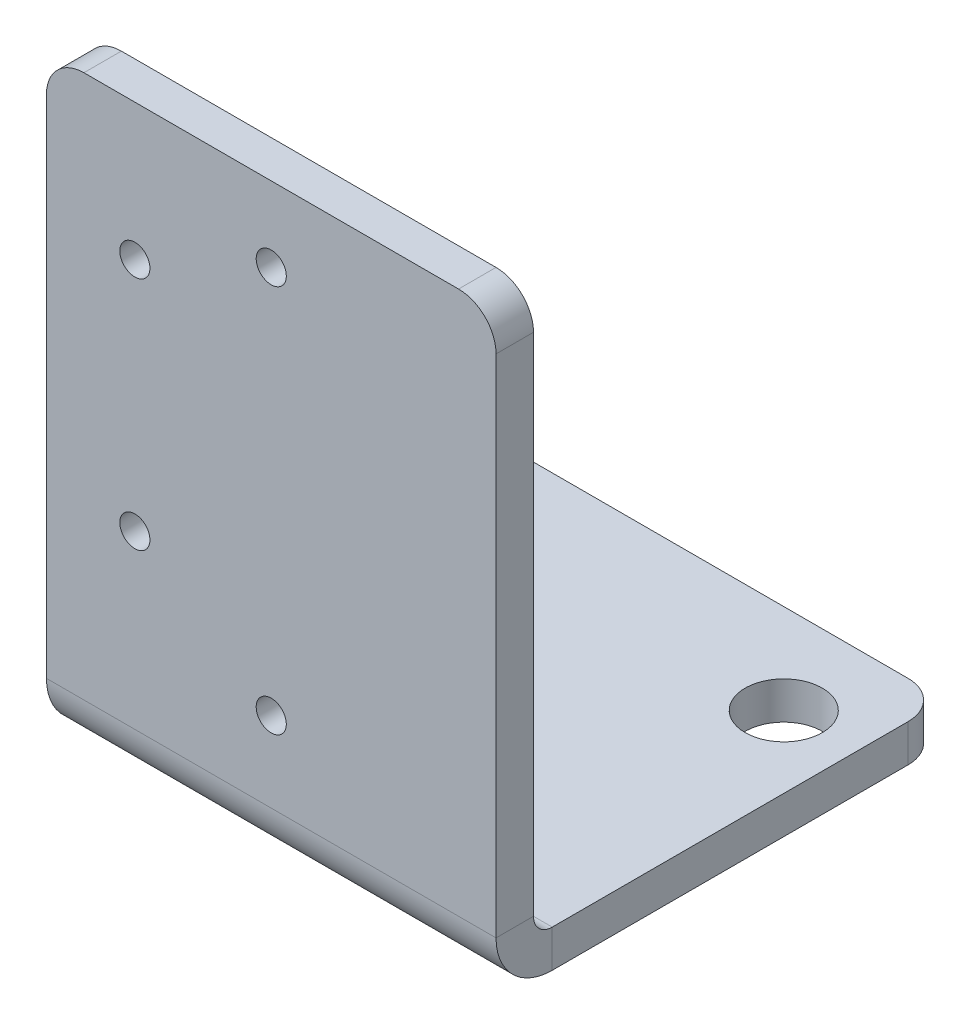
ISO-10303-21;
HEADER;
FILE_DESCRIPTION(('STEP AP214'),'2;1');
FILE_NAME('part.step','',(''),(''),'','','');
FILE_SCHEMA(('AUTOMOTIVE_DESIGN { 1 0 10303 214 1 1 1 1 }'));
ENDSEC;
DATA;
#1=APPLICATION_CONTEXT('core data for automotive mechanical design processes');
#2=APPLICATION_PROTOCOL_DEFINITION('international standard','automotive_design',2000,#1);
#3=PRODUCT_CONTEXT('',#1,'mechanical');
#4=PRODUCT('Part','Part','',(#3));
#5=PRODUCT_RELATED_PRODUCT_CATEGORY('part','',(#4));
#6=PRODUCT_DEFINITION_FORMATION('','',#4);
#7=PRODUCT_DEFINITION_CONTEXT('part definition',#1,'design');
#8=PRODUCT_DEFINITION('design','',#6,#7);
#9=PRODUCT_DEFINITION_SHAPE('','',#8);
#10=(LENGTH_UNIT() NAMED_UNIT(*) SI_UNIT(.MILLI.,.METRE.));
#11=(NAMED_UNIT(*) PLANE_ANGLE_UNIT() SI_UNIT($,.RADIAN.));
#12=(NAMED_UNIT(*) SI_UNIT($,.STERADIAN.) SOLID_ANGLE_UNIT());
#13=UNCERTAINTY_MEASURE_WITH_UNIT(LENGTH_MEASURE(1.E-05),#10,'distance_accuracy_value','');
#14=(GEOMETRIC_REPRESENTATION_CONTEXT(3) GLOBAL_UNCERTAINTY_ASSIGNED_CONTEXT((#13)) GLOBAL_UNIT_ASSIGNED_CONTEXT((#10,
#11,#12)) REPRESENTATION_CONTEXT('',''));
#15=CARTESIAN_POINT('',(0.,0.,0.));
#16=DIRECTION('',(0.,0.,1.));
#17=DIRECTION('',(1.,0.,0.));
#18=AXIS2_PLACEMENT_3D('',#15,#16,#17);
#19=CARTESIAN_POINT('',(76.2,9.525,0.));
#20=DIRECTION('',(1.,0.,0.));
#21=DIRECTION('',(0.,0.,-1.));
#22=AXIS2_PLACEMENT_3D('',#19,#20,#21);
#23=PLANE('',#22);
#24=DIRECTION('',(0.,0.,-1.));
#25=VECTOR('',#24,1.);
#26=CARTESIAN_POINT('',(76.2,9.525,0.));
#27=LINE('',#26,#25);
#28=CARTESIAN_POINT('',(76.2,9.525,0.));
#29=VERTEX_POINT('',#28);
#30=CARTESIAN_POINT('',(76.2,9.525,-6.35));
#31=VERTEX_POINT('',#30);
#32=EDGE_CURVE('E209',#29,#31,#27,.T.);
#33=ORIENTED_EDGE('',*,*,#32,.F.);
#34=CARTESIAN_POINT('',(76.2,9.525,-9.525));
#35=DIRECTION('',(-1.,0.,0.));
#36=DIRECTION('',(0.,0.,1.));
#37=AXIS2_PLACEMENT_3D('',#34,#35,#36);
#38=CIRCLE('',#37,9.525);
#39=CARTESIAN_POINT('',(76.2,0.,-9.525));
#40=VERTEX_POINT('',#39);
#41=EDGE_CURVE('E188',#29,#40,#38,.F.);
#42=ORIENTED_EDGE('',*,*,#41,.T.);
#43=DIRECTION('',(0.,-1.,0.));
#44=VECTOR('',#43,1.);
#45=CARTESIAN_POINT('',(76.2,6.35,-9.525));
#46=LINE('',#45,#44);
#47=CARTESIAN_POINT('',(76.2,6.35,-9.525));
#48=VERTEX_POINT('',#47);
#49=EDGE_CURVE('E141',#48,#40,#46,.T.);
#50=ORIENTED_EDGE('',*,*,#49,.F.);
#51=CARTESIAN_POINT('',(76.2,9.525,-9.525));
#52=DIRECTION('',(1.,0.,0.));
#53=DIRECTION('',(0.,0.,-1.));
#54=AXIS2_PLACEMENT_3D('',#51,#52,#53);
#55=CIRCLE('',#54,3.175);
#56=EDGE_CURVE('E153',#31,#48,#55,.T.);
#57=ORIENTED_EDGE('',*,*,#56,.F.);
#58=EDGE_LOOP('',(#33,#42,#50,#57));
#59=FACE_BOUND('',#58,.T.);
#60=ADVANCED_FACE('F38',(#59),#23,.T.);
#61=CARTESIAN_POINT('',(76.2,6.35,-9.525));
#62=DIRECTION('',(1.,0.,0.));
#63=DIRECTION('',(0.,0.,-1.));
#64=AXIS2_PLACEMENT_3D('',#61,#62,#63);
#65=PLANE('',#64);
#66=DIRECTION('',(0.,1.,0.));
#67=VECTOR('',#66,1.);
#68=CARTESIAN_POINT('',(76.2,0.,-6.35));
#69=LINE('',#68,#67);
#70=CARTESIAN_POINT('',(76.2,95.25,-6.35));
#71=VERTEX_POINT('',#70);
#72=EDGE_CURVE('E184',#71,#31,#69,.F.);
#73=ORIENTED_EDGE('',*,*,#72,.F.);
#74=DIRECTION('',(0.,0.,-1.));
#75=VECTOR('',#74,1.);
#76=CARTESIAN_POINT('',(76.2,95.25,-9.525));
#77=LINE('',#76,#75);
#78=CARTESIAN_POINT('',(76.2,95.25,0.));
#79=VERTEX_POINT('',#78);
#80=EDGE_CURVE('E60',#71,#79,#77,.F.);
#81=ORIENTED_EDGE('',*,*,#80,.T.);
#82=DIRECTION('',(0.,-1.,0.));
#83=VECTOR('',#82,1.);
#84=CARTESIAN_POINT('',(76.2,0.,0.));
#85=LINE('',#84,#83);
#86=EDGE_CURVE('E186',#79,#29,#85,.T.);
#87=ORIENTED_EDGE('',*,*,#86,.T.);
#88=ORIENTED_EDGE('',*,*,#32,.T.);
#89=EDGE_LOOP('',(#73,#81,#87,#88));
#90=FACE_BOUND('',#89,.T.);
#91=ADVANCED_FACE('F268',(#90),#65,.T.);
#92=CARTESIAN_POINT('',(0.,0.,-9.525));
#93=DIRECTION('',(-1.,0.,0.));
#94=DIRECTION('',(0.,0.,1.));
#95=AXIS2_PLACEMENT_3D('',#92,#93,#94);
#96=PLANE('',#95);
#97=DIRECTION('',(0.,1.,0.));
#98=VECTOR('',#97,1.);
#99=CARTESIAN_POINT('',(0.,0.,-9.525));
#100=LINE('',#99,#98);
#101=CARTESIAN_POINT('',(0.,0.,-9.525));
#102=VERTEX_POINT('',#101);
#103=CARTESIAN_POINT('',(0.,6.35,-9.525));
#104=VERTEX_POINT('',#103);
#105=EDGE_CURVE('E128',#102,#104,#100,.T.);
#106=ORIENTED_EDGE('',*,*,#105,.F.);
#107=CARTESIAN_POINT('',(0.,9.525,-9.525));
#108=DIRECTION('',(-1.,0.,0.));
#109=DIRECTION('',(0.,0.,1.));
#110=AXIS2_PLACEMENT_3D('',#107,#108,#109);
#111=CIRCLE('',#110,9.525);
#112=CARTESIAN_POINT('',(0.,9.525,0.));
#113=VERTEX_POINT('',#112);
#114=EDGE_CURVE('E176',#113,#102,#111,.F.);
#115=ORIENTED_EDGE('',*,*,#114,.F.);
#116=DIRECTION('',(0.,0.,1.));
#117=VECTOR('',#116,1.);
#118=CARTESIAN_POINT('',(0.,9.525,-6.35));
#119=LINE('',#118,#117);
#120=CARTESIAN_POINT('',(0.,9.525,-6.35));
#121=VERTEX_POINT('',#120);
#122=EDGE_CURVE('E142',#121,#113,#119,.T.);
#123=ORIENTED_EDGE('',*,*,#122,.F.);
#124=CARTESIAN_POINT('',(0.,9.525,-9.525));
#125=DIRECTION('',(1.,0.,0.));
#126=DIRECTION('',(0.,0.,-1.));
#127=AXIS2_PLACEMENT_3D('',#124,#125,#126);
#128=CIRCLE('',#127,3.175);
#129=EDGE_CURVE('E151',#121,#104,#128,.T.);
#130=ORIENTED_EDGE('',*,*,#129,.T.);
#131=EDGE_LOOP('',(#106,#115,#123,#130));
#132=FACE_BOUND('',#131,.T.);
#133=ADVANCED_FACE('F166',(#132),#96,.T.);
#134=CARTESIAN_POINT('',(0.,9.525,-6.35));
#135=DIRECTION('',(-1.,0.,0.));
#136=DIRECTION('',(0.,0.,1.));
#137=AXIS2_PLACEMENT_3D('',#134,#135,#136);
#138=PLANE('',#137);
#139=DIRECTION('',(0.,0.,-1.));
#140=VECTOR('',#139,1.);
#141=CARTESIAN_POINT('',(0.,6.35,0.));
#142=LINE('',#141,#140);
#143=CARTESIAN_POINT('',(0.,6.35,-69.85));
#144=VERTEX_POINT('',#143);
#145=EDGE_CURVE('E133',#104,#144,#142,.T.);
#146=ORIENTED_EDGE('',*,*,#145,.T.);
#147=DIRECTION('',(0.,-1.,0.));
#148=VECTOR('',#147,1.);
#149=CARTESIAN_POINT('',(0.,9.525,-69.85));
#150=LINE('',#149,#148);
#151=CARTESIAN_POINT('',(0.,0.,-69.85));
#152=VERTEX_POINT('',#151);
#153=EDGE_CURVE('E212',#144,#152,#150,.T.);
#154=ORIENTED_EDGE('',*,*,#153,.T.);
#155=DIRECTION('',(0.,0.,-1.));
#156=VECTOR('',#155,1.);
#157=CARTESIAN_POINT('',(0.,0.,0.));
#158=LINE('',#157,#156);
#159=EDGE_CURVE('E136',#102,#152,#158,.T.);
#160=ORIENTED_EDGE('',*,*,#159,.F.);
#161=ORIENTED_EDGE('',*,*,#105,.T.);
#162=EDGE_LOOP('',(#146,#154,#160,#161));
#163=FACE_BOUND('',#162,.T.);
#164=ADVANCED_FACE('F130',(#163),#138,.T.);
#165=CARTESIAN_POINT('',(76.2,0.,0.));
#166=DIRECTION('',(0.,1.,0.));
#167=DIRECTION('',(0.,0.,1.));
#168=AXIS2_PLACEMENT_3D('',#165,#166,#167);
#169=PLANE('',#168);
#170=CARTESIAN_POINT('',(64.008,0.,-60.96));
#171=DIRECTION('',(0.,1.,0.));
#172=DIRECTION('',(0.,0.,1.));
#173=AXIS2_PLACEMENT_3D('',#170,#171,#172);
#174=CIRCLE('',#173,6.5405);
#175=CARTESIAN_POINT('',(64.008,0.,-54.4195));
#176=VERTEX_POINT('',#175);
#177=EDGE_CURVE('E382',#176,#176,#174,.T.);
#178=ORIENTED_EDGE('',*,*,#177,.T.);
#179=EDGE_LOOP('',(#178));
#180=FACE_BOUND('',#179,.T.);
#181=CARTESIAN_POINT('',(12.1158,0.,-24.384));
#182=DIRECTION('',(0.,1.,0.));
#183=DIRECTION('',(0.,0.,1.));
#184=AXIS2_PLACEMENT_3D('',#181,#182,#183);
#185=CIRCLE('',#184,6.5405);
#186=CARTESIAN_POINT('',(12.1158,0.,-17.8435));
#187=VERTEX_POINT('',#186);
#188=EDGE_CURVE('E388',#187,#187,#185,.T.);
#189=ORIENTED_EDGE('',*,*,#188,.T.);
#190=EDGE_LOOP('',(#189));
#191=FACE_BOUND('',#190,.T.);
#192=ORIENTED_EDGE('',*,*,#159,.T.);
#193=CARTESIAN_POINT('',(6.35,0.,-69.85));
#194=DIRECTION('',(0.,1.,0.));
#195=DIRECTION('',(0.,0.,1.));
#196=AXIS2_PLACEMENT_3D('',#193,#194,#195);
#197=CIRCLE('',#196,6.35);
#198=CARTESIAN_POINT('',(6.35000000000002,0.,-76.2));
#199=VERTEX_POINT('',#198);
#200=EDGE_CURVE('E233',#152,#199,#197,.F.);
#201=ORIENTED_EDGE('',*,*,#200,.T.);
#202=DIRECTION('',(-1.,0.,0.));
#203=VECTOR('',#202,1.);
#204=CARTESIAN_POINT('',(76.2,0.,-76.2));
#205=LINE('',#204,#203);
#206=CARTESIAN_POINT('',(69.85,0.,-76.2));
#207=VERTEX_POINT('',#206);
#208=EDGE_CURVE('E204',#207,#199,#205,.T.);
#209=ORIENTED_EDGE('',*,*,#208,.F.);
#210=CARTESIAN_POINT('',(69.85,0.,-69.85));
#211=DIRECTION('',(0.,1.,0.));
#212=DIRECTION('',(0.,0.,1.));
#213=AXIS2_PLACEMENT_3D('',#210,#211,#212);
#214=CIRCLE('',#213,6.35);
#215=CARTESIAN_POINT('',(76.2,0.,-69.85));
#216=VERTEX_POINT('',#215);
#217=EDGE_CURVE('E231',#207,#216,#214,.F.);
#218=ORIENTED_EDGE('',*,*,#217,.T.);
#219=DIRECTION('',(0.,0.,-1.));
#220=VECTOR('',#219,1.);
#221=CARTESIAN_POINT('',(76.2,0.,0.));
#222=LINE('',#221,#220);
#223=EDGE_CURVE('E178',#40,#216,#222,.T.);
#224=ORIENTED_EDGE('',*,*,#223,.F.);
#225=DIRECTION('',(-1.,0.,0.));
#226=VECTOR('',#225,1.);
#227=CARTESIAN_POINT('',(76.2,0.,-9.525));
#228=LINE('',#227,#226);
#229=EDGE_CURVE('E191',#40,#102,#228,.T.);
#230=ORIENTED_EDGE('',*,*,#229,.T.);
#231=EDGE_LOOP('',(#192,#201,#209,#218,#224,#230));
#232=FACE_BOUND('',#231,.T.);
#233=ADVANCED_FACE('F288',(#180,#191,#232),#169,.F.);
#234=CARTESIAN_POINT('',(76.2,6.35,-76.2));
#235=DIRECTION('',(0.,0.,-1.));
#236=DIRECTION('',(-1.,0.,0.));
#237=AXIS2_PLACEMENT_3D('',#234,#235,#236);
#238=PLANE('',#237);
#239=ORIENTED_EDGE('',*,*,#208,.T.);
#240=DIRECTION('',(0.,-1.,0.));
#241=VECTOR('',#240,1.);
#242=CARTESIAN_POINT('',(6.34999999999999,6.35,-76.2));
#243=LINE('',#242,#241);
#244=CARTESIAN_POINT('',(6.35000000000002,6.35,-76.2));
#245=VERTEX_POINT('',#244);
#246=EDGE_CURVE('E238',#199,#245,#243,.F.);
#247=ORIENTED_EDGE('',*,*,#246,.T.);
#248=DIRECTION('',(-1.,0.,0.));
#249=VECTOR('',#248,1.);
#250=CARTESIAN_POINT('',(76.2,6.35,-76.2));
#251=LINE('',#250,#249);
#252=CARTESIAN_POINT('',(69.85,6.35,-76.2));
#253=VERTEX_POINT('',#252);
#254=EDGE_CURVE('E157',#253,#245,#251,.T.);
#255=ORIENTED_EDGE('',*,*,#254,.F.);
#256=DIRECTION('',(0.,-1.,0.));
#257=VECTOR('',#256,1.);
#258=CARTESIAN_POINT('',(69.85,6.35,-76.2));
#259=LINE('',#258,#257);
#260=EDGE_CURVE('E235',#253,#207,#259,.T.);
#261=ORIENTED_EDGE('',*,*,#260,.T.);
#262=EDGE_LOOP('',(#239,#247,#255,#261));
#263=FACE_BOUND('',#262,.T.);
#264=ADVANCED_FACE('F285',(#263),#238,.T.);
#265=CARTESIAN_POINT('',(76.2,6.35,0.));
#266=DIRECTION('',(0.,1.,0.));
#267=DIRECTION('',(0.,0.,1.));
#268=AXIS2_PLACEMENT_3D('',#265,#266,#267);
#269=PLANE('',#268);
#270=CARTESIAN_POINT('',(64.008,6.35,-60.96));
#271=DIRECTION('',(0.,1.,0.));
#272=DIRECTION('',(0.,0.,1.));
#273=AXIS2_PLACEMENT_3D('',#270,#271,#272);
#274=CIRCLE('',#273,6.5405);
#275=CARTESIAN_POINT('',(64.008,6.35,-54.4195));
#276=VERTEX_POINT('',#275);
#277=EDGE_CURVE('E216',#276,#276,#274,.T.);
#278=ORIENTED_EDGE('',*,*,#277,.F.);
#279=EDGE_LOOP('',(#278));
#280=FACE_BOUND('',#279,.T.);
#281=CARTESIAN_POINT('',(12.1158,6.35,-24.384));
#282=DIRECTION('',(0.,1.,0.));
#283=DIRECTION('',(0.,0.,1.));
#284=AXIS2_PLACEMENT_3D('',#281,#282,#283);
#285=CIRCLE('',#284,6.5405);
#286=CARTESIAN_POINT('',(12.1158,6.35,-17.8435));
#287=VERTEX_POINT('',#286);
#288=EDGE_CURVE('E385',#287,#287,#285,.T.);
#289=ORIENTED_EDGE('',*,*,#288,.F.);
#290=EDGE_LOOP('',(#289));
#291=FACE_BOUND('',#290,.T.);
#292=ORIENTED_EDGE('',*,*,#254,.T.);
#293=CARTESIAN_POINT('',(6.35,6.35,-69.85));
#294=DIRECTION('',(0.,1.,0.));
#295=DIRECTION('',(0.,0.,1.));
#296=AXIS2_PLACEMENT_3D('',#293,#294,#295);
#297=CIRCLE('',#296,6.35);
#298=EDGE_CURVE('E163',#245,#144,#297,.T.);
#299=ORIENTED_EDGE('',*,*,#298,.T.);
#300=ORIENTED_EDGE('',*,*,#145,.F.);
#301=DIRECTION('',(-1.,0.,0.));
#302=VECTOR('',#301,1.);
#303=CARTESIAN_POINT('',(76.2,6.35,-9.525));
#304=LINE('',#303,#302);
#305=EDGE_CURVE('E148',#48,#104,#304,.T.);
#306=ORIENTED_EDGE('',*,*,#305,.F.);
#307=DIRECTION('',(0.,0.,-1.));
#308=VECTOR('',#307,1.);
#309=CARTESIAN_POINT('',(76.2,6.35,0.));
#310=LINE('',#309,#308);
#311=CARTESIAN_POINT('',(76.2,6.35,-69.85));
#312=VERTEX_POINT('',#311);
#313=EDGE_CURVE('E181',#48,#312,#310,.T.);
#314=ORIENTED_EDGE('',*,*,#313,.T.);
#315=CARTESIAN_POINT('',(69.85,6.35,-69.85));
#316=DIRECTION('',(0.,1.,0.));
#317=DIRECTION('',(0.,0.,1.));
#318=AXIS2_PLACEMENT_3D('',#315,#316,#317);
#319=CIRCLE('',#318,6.35);
#320=EDGE_CURVE('E240',#312,#253,#319,.T.);
#321=ORIENTED_EDGE('',*,*,#320,.T.);
#322=EDGE_LOOP('',(#292,#299,#300,#306,#314,#321));
#323=FACE_BOUND('',#322,.T.);
#324=ADVANCED_FACE('F161',(#280,#291,#323),#269,.T.);
#325=CARTESIAN_POINT('',(76.2,9.525,-9.525));
#326=DIRECTION('',(-1.,0.,0.));
#327=DIRECTION('',(0.,0.,1.));
#328=AXIS2_PLACEMENT_3D('',#325,#326,#327);
#329=CYLINDRICAL_SURFACE('',#328,3.175);
#330=ORIENTED_EDGE('',*,*,#129,.F.);
#331=DIRECTION('',(-1.,0.,0.));
#332=VECTOR('',#331,1.);
#333=CARTESIAN_POINT('',(76.2,9.525,-6.35));
#334=LINE('',#333,#332);
#335=EDGE_CURVE('E158',#31,#121,#334,.T.);
#336=ORIENTED_EDGE('',*,*,#335,.F.);
#337=ORIENTED_EDGE('',*,*,#56,.T.);
#338=ORIENTED_EDGE('',*,*,#305,.T.);
#339=EDGE_LOOP('',(#330,#336,#337,#338));
#340=FACE_BOUND('',#339,.T.);
#341=ADVANCED_FACE('F149',(#340),#329,.F.);
#342=CARTESIAN_POINT('',(76.2,0.,-6.35));
#343=DIRECTION('',(0.,0.,-1.));
#344=DIRECTION('',(-1.,0.,0.));
#345=AXIS2_PLACEMENT_3D('',#342,#343,#344);
#346=PLANE('',#345);
#347=CARTESIAN_POINT('',(14.986,38.608,-6.35));
#348=DIRECTION('',(0.,0.,-1.));
#349=DIRECTION('',(-1.,0.,0.));
#350=AXIS2_PLACEMENT_3D('',#347,#348,#349);
#351=CIRCLE('',#350,2.5527);
#352=CARTESIAN_POINT('',(12.4333,38.608,-6.35));
#353=VERTEX_POINT('',#352);
#354=EDGE_CURVE('E229',#353,#353,#351,.T.);
#355=ORIENTED_EDGE('',*,*,#354,.F.);
#356=EDGE_LOOP('',(#355));
#357=FACE_BOUND('',#356,.T.);
#358=CARTESIAN_POINT('',(14.986,78.486,-6.35));
#359=DIRECTION('',(0.,0.,-1.));
#360=DIRECTION('',(-1.,0.,0.));
#361=AXIS2_PLACEMENT_3D('',#358,#359,#360);
#362=CIRCLE('',#361,2.5527);
#363=CARTESIAN_POINT('',(12.4333,78.486,-6.35));
#364=VERTEX_POINT('',#363);
#365=EDGE_CURVE('E225',#364,#364,#362,.T.);
#366=ORIENTED_EDGE('',*,*,#365,.F.);
#367=EDGE_LOOP('',(#366));
#368=FACE_BOUND('',#367,.T.);
#369=CARTESIAN_POINT('',(38.1,23.114,-6.35));
#370=DIRECTION('',(0.,0.,-1.));
#371=DIRECTION('',(-1.,0.,0.));
#372=AXIS2_PLACEMENT_3D('',#369,#370,#371);
#373=CIRCLE('',#372,2.5527);
#374=CARTESIAN_POINT('',(35.5473,23.114,-6.35));
#375=VERTEX_POINT('',#374);
#376=EDGE_CURVE('E221',#375,#375,#373,.T.);
#377=ORIENTED_EDGE('',*,*,#376,.F.);
#378=EDGE_LOOP('',(#377));
#379=FACE_BOUND('',#378,.T.);
#380=CARTESIAN_POINT('',(38.1,88.9,-6.35));
#381=DIRECTION('',(0.,0.,-1.));
#382=DIRECTION('',(-1.,0.,0.));
#383=AXIS2_PLACEMENT_3D('',#380,#381,#382);
#384=CIRCLE('',#383,2.5527);
#385=CARTESIAN_POINT('',(35.5473,88.9,-6.35));
#386=VERTEX_POINT('',#385);
#387=EDGE_CURVE('E217',#386,#386,#384,.T.);
#388=ORIENTED_EDGE('',*,*,#387,.F.);
#389=EDGE_LOOP('',(#388));
#390=FACE_BOUND('',#389,.T.);
#391=DIRECTION('',(-1.,0.,0.));
#392=VECTOR('',#391,1.);
#393=CARTESIAN_POINT('',(76.2,101.6,-6.35));
#394=LINE('',#393,#392);
#395=CARTESIAN_POINT('',(69.85,101.6,-6.35));
#396=VERTEX_POINT('',#395);
#397=CARTESIAN_POINT('',(6.35000000000002,101.6,-6.35));
#398=VERTEX_POINT('',#397);
#399=EDGE_CURVE('E199',#396,#398,#394,.T.);
#400=ORIENTED_EDGE('',*,*,#399,.F.);
#401=CARTESIAN_POINT('',(69.85,95.25,-6.35));
#402=DIRECTION('',(0.,0.,-1.));
#403=DIRECTION('',(-1.,0.,0.));
#404=AXIS2_PLACEMENT_3D('',#401,#402,#403);
#405=CIRCLE('',#404,6.35);
#406=EDGE_CURVE('E252',#396,#71,#405,.T.);
#407=ORIENTED_EDGE('',*,*,#406,.T.);
#408=ORIENTED_EDGE('',*,*,#72,.T.);
#409=ORIENTED_EDGE('',*,*,#335,.T.);
#410=DIRECTION('',(0.,1.,0.));
#411=VECTOR('',#410,1.);
#412=CARTESIAN_POINT('',(0.,0.,-6.35));
#413=LINE('',#412,#411);
#414=CARTESIAN_POINT('',(0.,95.25,-6.35));
#415=VERTEX_POINT('',#414);
#416=EDGE_CURVE('E169',#415,#121,#413,.F.);
#417=ORIENTED_EDGE('',*,*,#416,.F.);
#418=CARTESIAN_POINT('',(6.35,95.25,-6.35));
#419=DIRECTION('',(0.,0.,-1.));
#420=DIRECTION('',(-1.,0.,0.));
#421=AXIS2_PLACEMENT_3D('',#418,#419,#420);
#422=CIRCLE('',#421,6.35);
#423=EDGE_CURVE('E250',#415,#398,#422,.T.);
#424=ORIENTED_EDGE('',*,*,#423,.T.);
#425=EDGE_LOOP('',(#400,#407,#408,#409,#417,#424));
#426=FACE_BOUND('',#425,.T.);
#427=ADVANCED_FACE('F267',(#357,#368,#379,#390,#426),#346,.T.);
#428=CARTESIAN_POINT('',(76.2,101.6,0.));
#429=DIRECTION('',(0.,1.,0.));
#430=DIRECTION('',(0.,0.,1.));
#431=AXIS2_PLACEMENT_3D('',#428,#429,#430);
#432=PLANE('',#431);
#433=DIRECTION('',(-1.,0.,0.));
#434=VECTOR('',#433,1.);
#435=CARTESIAN_POINT('',(76.2,101.6,0.));
#436=LINE('',#435,#434);
#437=CARTESIAN_POINT('',(69.85,101.6,0.));
#438=VERTEX_POINT('',#437);
#439=CARTESIAN_POINT('',(6.35000000000002,101.6,0.));
#440=VERTEX_POINT('',#439);
#441=EDGE_CURVE('E197',#438,#440,#436,.T.);
#442=ORIENTED_EDGE('',*,*,#441,.F.);
#443=DIRECTION('',(0.,0.,-1.));
#444=VECTOR('',#443,1.);
#445=CARTESIAN_POINT('',(69.85,101.6,0.));
#446=LINE('',#445,#444);
#447=EDGE_CURVE('E247',#438,#396,#446,.T.);
#448=ORIENTED_EDGE('',*,*,#447,.T.);
#449=ORIENTED_EDGE('',*,*,#399,.T.);
#450=DIRECTION('',(0.,0.,-1.));
#451=VECTOR('',#450,1.);
#452=CARTESIAN_POINT('',(6.35,101.6,0.));
#453=LINE('',#452,#451);
#454=EDGE_CURVE('E245',#398,#440,#453,.F.);
#455=ORIENTED_EDGE('',*,*,#454,.T.);
#456=EDGE_LOOP('',(#442,#448,#449,#455));
#457=FACE_BOUND('',#456,.T.);
#458=ADVANCED_FACE('F262',(#457),#432,.T.);
#459=CARTESIAN_POINT('',(76.2,0.,0.));
#460=DIRECTION('',(0.,0.,-1.));
#461=DIRECTION('',(-1.,0.,0.));
#462=AXIS2_PLACEMENT_3D('',#459,#460,#461);
#463=PLANE('',#462);
#464=CARTESIAN_POINT('',(14.986,38.608,0.));
#465=DIRECTION('',(0.,0.,-1.));
#466=DIRECTION('',(-1.,0.,0.));
#467=AXIS2_PLACEMENT_3D('',#464,#465,#466);
#468=CIRCLE('',#467,2.5527);
#469=CARTESIAN_POINT('',(12.4333,38.608,0.));
#470=VERTEX_POINT('',#469);
#471=EDGE_CURVE('E226',#470,#470,#468,.T.);
#472=ORIENTED_EDGE('',*,*,#471,.T.);
#473=EDGE_LOOP('',(#472));
#474=FACE_BOUND('',#473,.T.);
#475=CARTESIAN_POINT('',(14.986,78.486,0.));
#476=DIRECTION('',(0.,0.,-1.));
#477=DIRECTION('',(-1.,0.,0.));
#478=AXIS2_PLACEMENT_3D('',#475,#476,#477);
#479=CIRCLE('',#478,2.5527);
#480=CARTESIAN_POINT('',(12.4333,78.486,0.));
#481=VERTEX_POINT('',#480);
#482=EDGE_CURVE('E222',#481,#481,#479,.T.);
#483=ORIENTED_EDGE('',*,*,#482,.T.);
#484=EDGE_LOOP('',(#483));
#485=FACE_BOUND('',#484,.T.);
#486=CARTESIAN_POINT('',(38.1,23.114,0.));
#487=DIRECTION('',(0.,0.,-1.));
#488=DIRECTION('',(-1.,0.,0.));
#489=AXIS2_PLACEMENT_3D('',#486,#487,#488);
#490=CIRCLE('',#489,2.5527);
#491=CARTESIAN_POINT('',(35.5473,23.114,0.));
#492=VERTEX_POINT('',#491);
#493=EDGE_CURVE('E218',#492,#492,#490,.T.);
#494=ORIENTED_EDGE('',*,*,#493,.T.);
#495=EDGE_LOOP('',(#494));
#496=FACE_BOUND('',#495,.T.);
#497=CARTESIAN_POINT('',(38.1,88.9,0.));
#498=DIRECTION('',(0.,0.,-1.));
#499=DIRECTION('',(-1.,0.,0.));
#500=AXIS2_PLACEMENT_3D('',#497,#498,#499);
#501=CIRCLE('',#500,2.5527);
#502=CARTESIAN_POINT('',(35.5473,88.9,0.));
#503=VERTEX_POINT('',#502);
#504=EDGE_CURVE('E213',#503,#503,#501,.T.);
#505=ORIENTED_EDGE('',*,*,#504,.T.);
#506=EDGE_LOOP('',(#505));
#507=FACE_BOUND('',#506,.T.);
#508=ORIENTED_EDGE('',*,*,#86,.F.);
#509=CARTESIAN_POINT('',(69.85,95.25,0.));
#510=DIRECTION('',(0.,0.,-1.));
#511=DIRECTION('',(-1.,0.,0.));
#512=AXIS2_PLACEMENT_3D('',#509,#510,#511);
#513=CIRCLE('',#512,6.35);
#514=EDGE_CURVE('E45',#79,#438,#513,.F.);
#515=ORIENTED_EDGE('',*,*,#514,.T.);
#516=ORIENTED_EDGE('',*,*,#441,.T.);
#517=CARTESIAN_POINT('',(6.35,95.25,0.));
#518=DIRECTION('',(0.,0.,-1.));
#519=DIRECTION('',(-1.,0.,0.));
#520=AXIS2_PLACEMENT_3D('',#517,#518,#519);
#521=CIRCLE('',#520,6.35);
#522=CARTESIAN_POINT('',(0.,95.25,0.));
#523=VERTEX_POINT('',#522);
#524=EDGE_CURVE('E52',#440,#523,#521,.F.);
#525=ORIENTED_EDGE('',*,*,#524,.T.);
#526=DIRECTION('',(0.,-1.,0.));
#527=VECTOR('',#526,1.);
#528=CARTESIAN_POINT('',(0.,0.,0.));
#529=LINE('',#528,#527);
#530=EDGE_CURVE('E171',#523,#113,#529,.T.);
#531=ORIENTED_EDGE('',*,*,#530,.T.);
#532=DIRECTION('',(-1.,0.,0.));
#533=VECTOR('',#532,1.);
#534=CARTESIAN_POINT('',(76.2,9.525,0.));
#535=LINE('',#534,#533);
#536=EDGE_CURVE('E194',#29,#113,#535,.T.);
#537=ORIENTED_EDGE('',*,*,#536,.F.);
#538=EDGE_LOOP('',(#508,#515,#516,#525,#531,#537));
#539=FACE_BOUND('',#538,.T.);
#540=ADVANCED_FACE('F257',(#474,#485,#496,#507,#539),#463,.F.);
#541=CARTESIAN_POINT('',(76.2,9.525,-9.525));
#542=DIRECTION('',(-1.,0.,0.));
#543=DIRECTION('',(0.,0.,1.));
#544=AXIS2_PLACEMENT_3D('',#541,#542,#543);
#545=CYLINDRICAL_SURFACE('',#544,9.525);
#546=ORIENTED_EDGE('',*,*,#114,.T.);
#547=ORIENTED_EDGE('',*,*,#229,.F.);
#548=ORIENTED_EDGE('',*,*,#41,.F.);
#549=ORIENTED_EDGE('',*,*,#536,.T.);
#550=EDGE_LOOP('',(#546,#547,#548,#549));
#551=FACE_BOUND('',#550,.T.);
#552=ADVANCED_FACE('F330',(#551),#545,.T.);
#553=CARTESIAN_POINT('',(76.2,9.525,-9.525));
#554=DIRECTION('',(1.,0.,0.));
#555=DIRECTION('',(0.,0.,-1.));
#556=AXIS2_PLACEMENT_3D('',#553,#554,#555);
#557=PLANE('',#556);
#558=ORIENTED_EDGE('',*,*,#223,.T.);
#559=DIRECTION('',(0.,-1.,0.));
#560=VECTOR('',#559,1.);
#561=CARTESIAN_POINT('',(76.2,9.525,-69.85));
#562=LINE('',#561,#560);
#563=EDGE_CURVE('E243',#216,#312,#562,.F.);
#564=ORIENTED_EDGE('',*,*,#563,.T.);
#565=ORIENTED_EDGE('',*,*,#313,.F.);
#566=ORIENTED_EDGE('',*,*,#49,.T.);
#567=EDGE_LOOP('',(#558,#564,#565,#566));
#568=FACE_BOUND('',#567,.T.);
#569=ADVANCED_FACE('F275',(#568),#557,.T.);
#570=CARTESIAN_POINT('',(0.,9.525,-9.525));
#571=DIRECTION('',(1.,0.,0.));
#572=DIRECTION('',(0.,0.,-1.));
#573=AXIS2_PLACEMENT_3D('',#570,#571,#572);
#574=PLANE('',#573);
#575=ORIENTED_EDGE('',*,*,#530,.F.);
#576=DIRECTION('',(0.,0.,-1.));
#577=VECTOR('',#576,1.);
#578=CARTESIAN_POINT('',(0.,95.25,-6.35));
#579=LINE('',#578,#577);
#580=EDGE_CURVE('E11',#523,#415,#579,.T.);
#581=ORIENTED_EDGE('',*,*,#580,.T.);
#582=ORIENTED_EDGE('',*,*,#416,.T.);
#583=ORIENTED_EDGE('',*,*,#122,.T.);
#584=EDGE_LOOP('',(#575,#581,#582,#583));
#585=FACE_BOUND('',#584,.T.);
#586=ADVANCED_FACE('F337',(#585),#574,.F.);
#587=CARTESIAN_POINT('',(12.1158,-6.35,-24.384));
#588=DIRECTION('',(0.,1.,0.));
#589=DIRECTION('',(0.,0.,1.));
#590=AXIS2_PLACEMENT_3D('',#587,#588,#589);
#591=CYLINDRICAL_SURFACE('',#590,6.5405);
#592=ORIENTED_EDGE('',*,*,#288,.T.);
#593=EDGE_LOOP('',(#592));
#594=FACE_BOUND('',#593,.T.);
#595=ORIENTED_EDGE('',*,*,#188,.F.);
#596=EDGE_LOOP('',(#595));
#597=FACE_BOUND('',#596,.T.);
#598=ADVANCED_FACE('F340',(#594,#597),#591,.F.);
#599=CARTESIAN_POINT('',(64.008,-6.35,-60.96));
#600=DIRECTION('',(0.,1.,0.));
#601=DIRECTION('',(0.,0.,1.));
#602=AXIS2_PLACEMENT_3D('',#599,#600,#601);
#603=CYLINDRICAL_SURFACE('',#602,6.5405);
#604=ORIENTED_EDGE('',*,*,#277,.T.);
#605=EDGE_LOOP('',(#604));
#606=FACE_BOUND('',#605,.T.);
#607=ORIENTED_EDGE('',*,*,#177,.F.);
#608=EDGE_LOOP('',(#607));
#609=FACE_BOUND('',#608,.T.);
#610=ADVANCED_FACE('F344',(#606,#609),#603,.F.);
#611=CARTESIAN_POINT('',(38.1,88.9,6.35));
#612=DIRECTION('',(0.,0.,-1.));
#613=DIRECTION('',(-1.,0.,0.));
#614=AXIS2_PLACEMENT_3D('',#611,#612,#613);
#615=CYLINDRICAL_SURFACE('',#614,2.5527);
#616=ORIENTED_EDGE('',*,*,#387,.T.);
#617=EDGE_LOOP('',(#616));
#618=FACE_BOUND('',#617,.T.);
#619=ORIENTED_EDGE('',*,*,#504,.F.);
#620=EDGE_LOOP('',(#619));
#621=FACE_BOUND('',#620,.T.);
#622=ADVANCED_FACE('F348',(#618,#621),#615,.F.);
#623=CARTESIAN_POINT('',(38.1,23.114,6.35));
#624=DIRECTION('',(0.,0.,-1.));
#625=DIRECTION('',(-1.,0.,0.));
#626=AXIS2_PLACEMENT_3D('',#623,#624,#625);
#627=CYLINDRICAL_SURFACE('',#626,2.5527);
#628=ORIENTED_EDGE('',*,*,#376,.T.);
#629=EDGE_LOOP('',(#628));
#630=FACE_BOUND('',#629,.T.);
#631=ORIENTED_EDGE('',*,*,#493,.F.);
#632=EDGE_LOOP('',(#631));
#633=FACE_BOUND('',#632,.T.);
#634=ADVANCED_FACE('F352',(#630,#633),#627,.F.);
#635=CARTESIAN_POINT('',(14.986,78.486,6.35));
#636=DIRECTION('',(0.,0.,-1.));
#637=DIRECTION('',(-1.,0.,0.));
#638=AXIS2_PLACEMENT_3D('',#635,#636,#637);
#639=CYLINDRICAL_SURFACE('',#638,2.5527);
#640=ORIENTED_EDGE('',*,*,#365,.T.);
#641=EDGE_LOOP('',(#640));
#642=FACE_BOUND('',#641,.T.);
#643=ORIENTED_EDGE('',*,*,#482,.F.);
#644=EDGE_LOOP('',(#643));
#645=FACE_BOUND('',#644,.T.);
#646=ADVANCED_FACE('F299',(#642,#645),#639,.F.);
#647=CARTESIAN_POINT('',(14.986,38.608,6.35));
#648=DIRECTION('',(0.,0.,-1.));
#649=DIRECTION('',(-1.,0.,0.));
#650=AXIS2_PLACEMENT_3D('',#647,#648,#649);
#651=CYLINDRICAL_SURFACE('',#650,2.5527);
#652=ORIENTED_EDGE('',*,*,#354,.T.);
#653=EDGE_LOOP('',(#652));
#654=FACE_BOUND('',#653,.T.);
#655=ORIENTED_EDGE('',*,*,#471,.F.);
#656=EDGE_LOOP('',(#655));
#657=FACE_BOUND('',#656,.T.);
#658=ADVANCED_FACE('F292',(#654,#657),#651,.F.);
#659=CARTESIAN_POINT('',(6.35,9.525,-69.85));
#660=DIRECTION('',(0.,-1.,0.));
#661=DIRECTION('',(0.,0.,-1.));
#662=AXIS2_PLACEMENT_3D('',#659,#660,#661);
#663=CYLINDRICAL_SURFACE('',#662,6.35);
#664=ORIENTED_EDGE('',*,*,#298,.F.);
#665=ORIENTED_EDGE('',*,*,#246,.F.);
#666=ORIENTED_EDGE('',*,*,#200,.F.);
#667=ORIENTED_EDGE('',*,*,#153,.F.);
#668=EDGE_LOOP('',(#664,#665,#666,#667));
#669=FACE_BOUND('',#668,.T.);
#670=ADVANCED_FACE('F290',(#669),#663,.T.);
#671=CARTESIAN_POINT('',(69.85,6.35,-69.85));
#672=DIRECTION('',(0.,-1.,0.));
#673=DIRECTION('',(0.,0.,-1.));
#674=AXIS2_PLACEMENT_3D('',#671,#672,#673);
#675=CYLINDRICAL_SURFACE('',#674,6.35);
#676=ORIENTED_EDGE('',*,*,#320,.F.);
#677=ORIENTED_EDGE('',*,*,#563,.F.);
#678=ORIENTED_EDGE('',*,*,#217,.F.);
#679=ORIENTED_EDGE('',*,*,#260,.F.);
#680=EDGE_LOOP('',(#676,#677,#678,#679));
#681=FACE_BOUND('',#680,.T.);
#682=ADVANCED_FACE('F282',(#681),#675,.T.);
#683=CARTESIAN_POINT('',(69.85,95.25,0.));
#684=DIRECTION('',(0.,0.,-1.));
#685=DIRECTION('',(-1.,0.,0.));
#686=AXIS2_PLACEMENT_3D('',#683,#684,#685);
#687=CYLINDRICAL_SURFACE('',#686,6.35);
#688=ORIENTED_EDGE('',*,*,#514,.F.);
#689=ORIENTED_EDGE('',*,*,#80,.F.);
#690=ORIENTED_EDGE('',*,*,#406,.F.);
#691=ORIENTED_EDGE('',*,*,#447,.F.);
#692=EDGE_LOOP('',(#688,#689,#690,#691));
#693=FACE_BOUND('',#692,.T.);
#694=ADVANCED_FACE('F265',(#693),#687,.T.);
#695=CARTESIAN_POINT('',(6.35,95.25,-9.525));
#696=DIRECTION('',(0.,0.,1.));
#697=DIRECTION('',(1.,0.,0.));
#698=AXIS2_PLACEMENT_3D('',#695,#696,#697);
#699=CYLINDRICAL_SURFACE('',#698,6.35);
#700=ORIENTED_EDGE('',*,*,#524,.F.);
#701=ORIENTED_EDGE('',*,*,#454,.F.);
#702=ORIENTED_EDGE('',*,*,#423,.F.);
#703=ORIENTED_EDGE('',*,*,#580,.F.);
#704=EDGE_LOOP('',(#700,#701,#702,#703));
#705=FACE_BOUND('',#704,.T.);
#706=ADVANCED_FACE('F505',(#705),#699,.T.);
#707=CLOSED_SHELL('',(#60,#91,#133,#164,#233,#264,#324,#341,#427,#458,#540,#552,#569,#586,#598,
#610,#622,#634,#646,#658,#670,#682,#694,#706));
#708=MANIFOLD_SOLID_BREP('B2',#707);
#709=ADVANCED_BREP_SHAPE_REPRESENTATION('',(#18,#708),#14);
#710=SHAPE_DEFINITION_REPRESENTATION(#9,#709);
ENDSEC;
END-ISO-10303-21;
